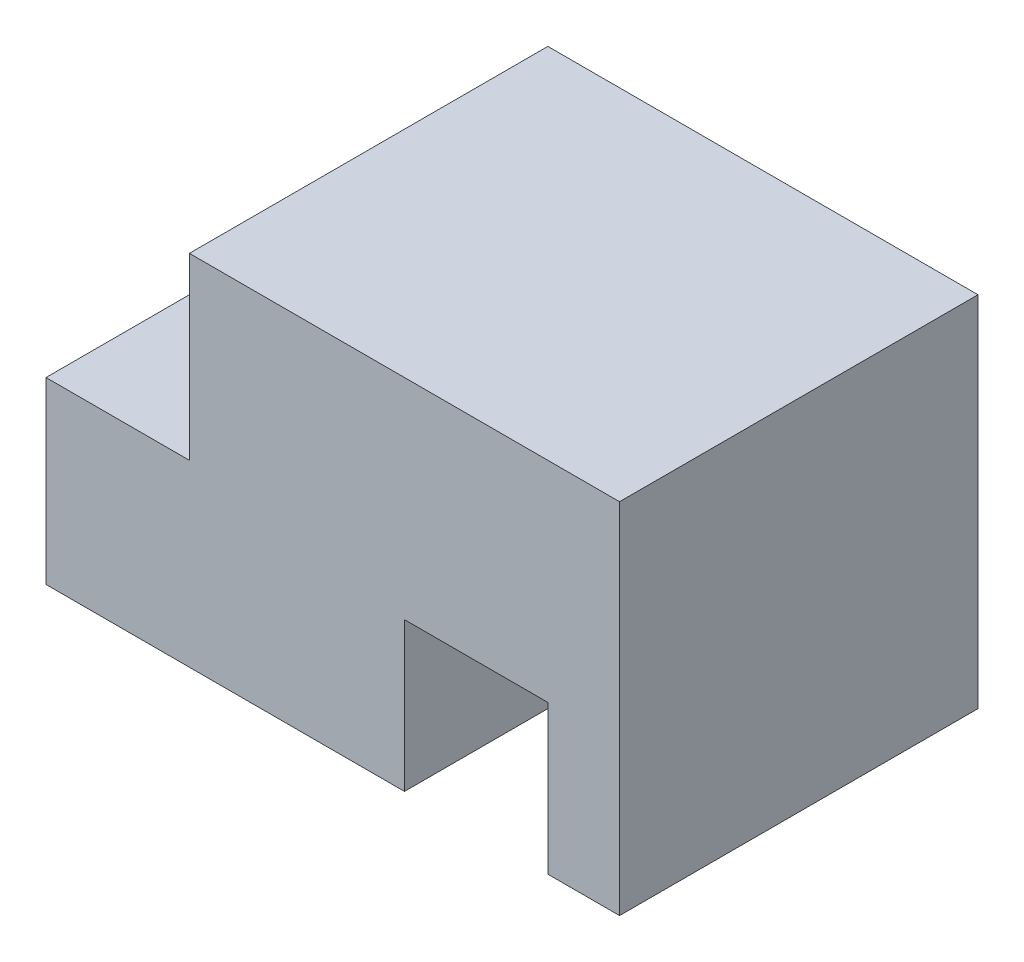
ISO-10303-21;
HEADER;
FILE_DESCRIPTION(('STEP AP214'),'2;1');
FILE_NAME('part.step','',(''),(''),'','','');
FILE_SCHEMA(('AUTOMOTIVE_DESIGN { 1 0 10303 214 1 1 1 1 }'));
ENDSEC;
DATA;
#1=APPLICATION_CONTEXT('core data for automotive mechanical design processes');
#2=APPLICATION_PROTOCOL_DEFINITION('international standard','automotive_design',2000,#1);
#3=PRODUCT_CONTEXT('',#1,'mechanical');
#4=PRODUCT('Part','Part','',(#3));
#5=PRODUCT_RELATED_PRODUCT_CATEGORY('part','',(#4));
#6=PRODUCT_DEFINITION_FORMATION('','',#4);
#7=PRODUCT_DEFINITION_CONTEXT('part definition',#1,'design');
#8=PRODUCT_DEFINITION('design','',#6,#7);
#9=PRODUCT_DEFINITION_SHAPE('','',#8);
#10=(LENGTH_UNIT() NAMED_UNIT(*) SI_UNIT(.MILLI.,.METRE.));
#11=(NAMED_UNIT(*) PLANE_ANGLE_UNIT() SI_UNIT($,.RADIAN.));
#12=(NAMED_UNIT(*) SI_UNIT($,.STERADIAN.) SOLID_ANGLE_UNIT());
#13=UNCERTAINTY_MEASURE_WITH_UNIT(LENGTH_MEASURE(1.E-05),#10,'distance_accuracy_value','');
#14=(GEOMETRIC_REPRESENTATION_CONTEXT(3) GLOBAL_UNCERTAINTY_ASSIGNED_CONTEXT((#13)) GLOBAL_UNIT_ASSIGNED_CONTEXT((#10,
#11,#12)) REPRESENTATION_CONTEXT('',''));
#15=CARTESIAN_POINT('',(0.,0.,0.));
#16=DIRECTION('',(0.,0.,1.));
#17=DIRECTION('',(1.,0.,0.));
#18=AXIS2_PLACEMENT_3D('',#15,#16,#17);
#19=CARTESIAN_POINT('',(-2511.75876010782,599.056603773585,1270.));
#20=DIRECTION('',(1.,0.,0.));
#21=DIRECTION('',(0.,0.,-1.));
#22=AXIS2_PLACEMENT_3D('',#19,#20,#21);
#23=PLANE('',#22);
#24=DIRECTION('',(0.,-1.,0.));
#25=VECTOR('',#24,1.);
#26=CARTESIAN_POINT('',(-2511.75876010782,599.056603773585,0.));
#27=LINE('',#26,#25);
#28=CARTESIAN_POINT('',(-2511.75876010782,599.056603773585,0.));
#29=VERTEX_POINT('',#28);
#30=CARTESIAN_POINT('',(-2511.75876010782,-35.9433962264152,0.));
#31=VERTEX_POINT('',#30);
#32=EDGE_CURVE('E160',#29,#31,#27,.T.);
#33=ORIENTED_EDGE('',*,*,#32,.T.);
#34=DIRECTION('',(0.,0.,-1.));
#35=VECTOR('',#34,1.);
#36=CARTESIAN_POINT('',(-2511.75876010782,-35.9433962264152,1270.));
#37=LINE('',#36,#35);
#38=CARTESIAN_POINT('',(-2511.75876010782,-35.9433962264152,1270.));
#39=VERTEX_POINT('',#38);
#40=EDGE_CURVE('E11',#39,#31,#37,.T.);
#41=ORIENTED_EDGE('',*,*,#40,.F.);
#42=DIRECTION('',(0.,-1.,0.));
#43=VECTOR('',#42,1.);
#44=CARTESIAN_POINT('',(-2511.75876010782,599.056603773585,1270.));
#45=LINE('',#44,#43);
#46=CARTESIAN_POINT('',(-2511.75876010782,599.056603773585,1270.));
#47=VERTEX_POINT('',#46);
#48=EDGE_CURVE('E188',#47,#39,#45,.T.);
#49=ORIENTED_EDGE('',*,*,#48,.F.);
#50=DIRECTION('',(0.,0.,-1.));
#51=VECTOR('',#50,1.);
#52=CARTESIAN_POINT('',(-2511.75876010782,599.056603773585,1270.));
#53=LINE('',#52,#51);
#54=EDGE_CURVE('E156',#47,#29,#53,.T.);
#55=ORIENTED_EDGE('',*,*,#54,.T.);
#56=EDGE_LOOP('',(#33,#41,#49,#55));
#57=FACE_BOUND('',#56,.T.);
#58=ADVANCED_FACE('F47',(#57),#23,.F.);
#59=CARTESIAN_POINT('',(-3019.75876010782,-35.9433962264152,1270.));
#60=DIRECTION('',(0.,-1.,0.));
#61=DIRECTION('',(1.,0.,0.));
#62=AXIS2_PLACEMENT_3D('',#59,#60,#61);
#63=PLANE('',#62);
#64=DIRECTION('',(-1.,0.,0.));
#65=VECTOR('',#64,1.);
#66=CARTESIAN_POINT('',(-3019.75876010782,-35.9433962264152,0.));
#67=LINE('',#66,#65);
#68=CARTESIAN_POINT('',(-3019.75876010782,-35.9433962264152,0.));
#69=VERTEX_POINT('',#68);
#70=EDGE_CURVE('E164',#31,#69,#67,.T.);
#71=ORIENTED_EDGE('',*,*,#70,.T.);
#72=DIRECTION('',(0.,0.,-1.));
#73=VECTOR('',#72,1.);
#74=CARTESIAN_POINT('',(-3019.75876010782,-35.9433962264152,1270.));
#75=LINE('',#74,#73);
#76=CARTESIAN_POINT('',(-3019.75876010782,-35.9433962264152,1270.));
#77=VERTEX_POINT('',#76);
#78=EDGE_CURVE('E56',#77,#69,#75,.T.);
#79=ORIENTED_EDGE('',*,*,#78,.F.);
#80=DIRECTION('',(-1.,0.,0.));
#81=VECTOR('',#80,1.);
#82=CARTESIAN_POINT('',(-3019.75876010782,-35.9433962264152,1270.));
#83=LINE('',#82,#81);
#84=EDGE_CURVE('E112',#39,#77,#83,.T.);
#85=ORIENTED_EDGE('',*,*,#84,.F.);
#86=ORIENTED_EDGE('',*,*,#40,.T.);
#87=EDGE_LOOP('',(#71,#79,#85,#86));
#88=FACE_BOUND('',#87,.T.);
#89=ADVANCED_FACE('F252',(#88),#63,.F.);
#90=CARTESIAN_POINT('',(-3019.75876010782,-35.9433962264152,1270.));
#91=DIRECTION('',(1.,0.,0.));
#92=DIRECTION('',(0.,0.,-1.));
#93=AXIS2_PLACEMENT_3D('',#90,#91,#92);
#94=PLANE('',#93);
#95=DIRECTION('',(0.,-1.,0.));
#96=VECTOR('',#95,1.);
#97=CARTESIAN_POINT('',(-3019.75876010782,-35.9433962264152,0.));
#98=LINE('',#97,#96);
#99=CARTESIAN_POINT('',(-3019.75876010782,-670.943396226415,0.));
#100=VERTEX_POINT('',#99);
#101=EDGE_CURVE('E167',#69,#100,#98,.T.);
#102=ORIENTED_EDGE('',*,*,#101,.T.);
#103=DIRECTION('',(0.,0.,-1.));
#104=VECTOR('',#103,1.);
#105=CARTESIAN_POINT('',(-3019.75876010782,-670.943396226415,1270.));
#106=LINE('',#105,#104);
#107=CARTESIAN_POINT('',(-3019.75876010782,-670.943396226415,1270.));
#108=VERTEX_POINT('',#107);
#109=EDGE_CURVE('E207',#108,#100,#106,.T.);
#110=ORIENTED_EDGE('',*,*,#109,.F.);
#111=DIRECTION('',(0.,-1.,0.));
#112=VECTOR('',#111,1.);
#113=CARTESIAN_POINT('',(-3019.75876010782,-35.9433962264152,1270.));
#114=LINE('',#113,#112);
#115=EDGE_CURVE('E217',#77,#108,#114,.T.);
#116=ORIENTED_EDGE('',*,*,#115,.F.);
#117=ORIENTED_EDGE('',*,*,#78,.T.);
#118=EDGE_LOOP('',(#102,#110,#116,#117));
#119=FACE_BOUND('',#118,.T.);
#120=ADVANCED_FACE('F215',(#119),#94,.F.);
#121=CARTESIAN_POINT('',(-3019.75876010782,-670.943396226415,1270.));
#122=DIRECTION('',(0.,1.,0.));
#123=DIRECTION('',(0.,0.,1.));
#124=AXIS2_PLACEMENT_3D('',#121,#122,#123);
#125=PLANE('',#124);
#126=DIRECTION('',(1.,0.,0.));
#127=VECTOR('',#126,1.);
#128=CARTESIAN_POINT('',(-3019.75876010782,-670.943396226415,0.));
#129=LINE('',#128,#127);
#130=CARTESIAN_POINT('',(-1749.75876010782,-670.943396226415,0.));
#131=VERTEX_POINT('',#130);
#132=EDGE_CURVE('E170',#100,#131,#129,.T.);
#133=ORIENTED_EDGE('',*,*,#132,.T.);
#134=DIRECTION('',(0.,0.,-1.));
#135=VECTOR('',#134,1.);
#136=CARTESIAN_POINT('',(-1749.75876010782,-670.943396226415,1270.));
#137=LINE('',#136,#135);
#138=CARTESIAN_POINT('',(-1749.75876010782,-670.943396226415,1270.));
#139=VERTEX_POINT('',#138);
#140=EDGE_CURVE('E203',#139,#131,#137,.T.);
#141=ORIENTED_EDGE('',*,*,#140,.F.);
#142=DIRECTION('',(1.,0.,0.));
#143=VECTOR('',#142,1.);
#144=CARTESIAN_POINT('',(-3019.75876010782,-670.943396226415,1270.));
#145=LINE('',#144,#143);
#146=EDGE_CURVE('E236',#108,#139,#145,.T.);
#147=ORIENTED_EDGE('',*,*,#146,.F.);
#148=ORIENTED_EDGE('',*,*,#109,.T.);
#149=EDGE_LOOP('',(#133,#141,#147,#148));
#150=FACE_BOUND('',#149,.T.);
#151=ADVANCED_FACE('F226',(#150),#125,.F.);
#152=CARTESIAN_POINT('',(-1749.75876010782,-143.77358490566,1270.));
#153=DIRECTION('',(-1.,0.,0.));
#154=DIRECTION('',(0.,-1.,0.));
#155=AXIS2_PLACEMENT_3D('',#152,#153,#154);
#156=PLANE('',#155);
#157=DIRECTION('',(0.,1.,0.));
#158=VECTOR('',#157,1.);
#159=CARTESIAN_POINT('',(-1749.75876010782,-143.77358490566,0.));
#160=LINE('',#159,#158);
#161=CARTESIAN_POINT('',(-1749.75876010782,-143.77358490566,0.));
#162=VERTEX_POINT('',#161);
#163=EDGE_CURVE('E173',#131,#162,#160,.T.);
#164=ORIENTED_EDGE('',*,*,#163,.T.);
#165=DIRECTION('',(0.,0.,-1.));
#166=VECTOR('',#165,1.);
#167=CARTESIAN_POINT('',(-1749.75876010782,-143.77358490566,1270.));
#168=LINE('',#167,#166);
#169=CARTESIAN_POINT('',(-1749.75876010782,-143.77358490566,1270.));
#170=VERTEX_POINT('',#169);
#171=EDGE_CURVE('E199',#170,#162,#168,.T.);
#172=ORIENTED_EDGE('',*,*,#171,.F.);
#173=DIRECTION('',(0.,1.,0.));
#174=VECTOR('',#173,1.);
#175=CARTESIAN_POINT('',(-1749.75876010782,-143.77358490566,1270.));
#176=LINE('',#175,#174);
#177=EDGE_CURVE('E232',#139,#170,#176,.T.);
#178=ORIENTED_EDGE('',*,*,#177,.F.);
#179=ORIENTED_EDGE('',*,*,#140,.T.);
#180=EDGE_LOOP('',(#164,#172,#178,#179));
#181=FACE_BOUND('',#180,.T.);
#182=ADVANCED_FACE('F230',(#181),#156,.F.);
#183=CARTESIAN_POINT('',(-1749.75876010782,-143.77358490566,1270.));
#184=DIRECTION('',(0.,1.,0.));
#185=DIRECTION('',(0.,0.,1.));
#186=AXIS2_PLACEMENT_3D('',#183,#184,#185);
#187=PLANE('',#186);
#188=DIRECTION('',(1.,0.,0.));
#189=VECTOR('',#188,1.);
#190=CARTESIAN_POINT('',(-1749.75876010782,-143.77358490566,0.));
#191=LINE('',#190,#189);
#192=CARTESIAN_POINT('',(-1241.75876010782,-143.77358490566,0.));
#193=VERTEX_POINT('',#192);
#194=EDGE_CURVE('E176',#162,#193,#191,.T.);
#195=ORIENTED_EDGE('',*,*,#194,.T.);
#196=DIRECTION('',(0.,0.,-1.));
#197=VECTOR('',#196,1.);
#198=CARTESIAN_POINT('',(-1241.75876010782,-143.77358490566,1270.));
#199=LINE('',#198,#197);
#200=CARTESIAN_POINT('',(-1241.75876010782,-143.77358490566,1270.));
#201=VERTEX_POINT('',#200);
#202=EDGE_CURVE('E195',#201,#193,#199,.T.);
#203=ORIENTED_EDGE('',*,*,#202,.F.);
#204=DIRECTION('',(1.,0.,0.));
#205=VECTOR('',#204,1.);
#206=CARTESIAN_POINT('',(-1749.75876010782,-143.77358490566,1270.));
#207=LINE('',#206,#205);
#208=EDGE_CURVE('E235',#170,#201,#207,.T.);
#209=ORIENTED_EDGE('',*,*,#208,.F.);
#210=ORIENTED_EDGE('',*,*,#171,.T.);
#211=EDGE_LOOP('',(#195,#203,#209,#210));
#212=FACE_BOUND('',#211,.T.);
#213=ADVANCED_FACE('F263',(#212),#187,.F.);
#214=CARTESIAN_POINT('',(-1241.75876010782,-143.77358490566,1270.));
#215=DIRECTION('',(1.,0.,0.));
#216=DIRECTION('',(0.,0.,-1.));
#217=AXIS2_PLACEMENT_3D('',#214,#215,#216);
#218=PLANE('',#217);
#219=DIRECTION('',(0.,-1.,0.));
#220=VECTOR('',#219,1.);
#221=CARTESIAN_POINT('',(-1241.75876010782,-143.77358490566,0.));
#222=LINE('',#221,#220);
#223=CARTESIAN_POINT('',(-1241.75876010782,-670.943396226415,0.));
#224=VERTEX_POINT('',#223);
#225=EDGE_CURVE('E179',#193,#224,#222,.T.);
#226=ORIENTED_EDGE('',*,*,#225,.T.);
#227=DIRECTION('',(0.,0.,-1.));
#228=VECTOR('',#227,1.);
#229=CARTESIAN_POINT('',(-1241.75876010782,-670.943396226415,1270.));
#230=LINE('',#229,#228);
#231=CARTESIAN_POINT('',(-1241.75876010782,-670.943396226415,1270.));
#232=VERTEX_POINT('',#231);
#233=EDGE_CURVE('E149',#232,#224,#230,.T.);
#234=ORIENTED_EDGE('',*,*,#233,.F.);
#235=DIRECTION('',(0.,-1.,0.));
#236=VECTOR('',#235,1.);
#237=CARTESIAN_POINT('',(-1241.75876010782,-143.77358490566,1270.));
#238=LINE('',#237,#236);
#239=EDGE_CURVE('E137',#201,#232,#238,.T.);
#240=ORIENTED_EDGE('',*,*,#239,.F.);
#241=ORIENTED_EDGE('',*,*,#202,.T.);
#242=EDGE_LOOP('',(#226,#234,#240,#241));
#243=FACE_BOUND('',#242,.T.);
#244=ADVANCED_FACE('F266',(#243),#218,.F.);
#245=CARTESIAN_POINT('',(-1241.75876010782,-670.943396226415,1270.));
#246=DIRECTION('',(0.,1.,0.));
#247=DIRECTION('',(0.,0.,1.));
#248=AXIS2_PLACEMENT_3D('',#245,#246,#247);
#249=PLANE('',#248);
#250=DIRECTION('',(1.,0.,0.));
#251=VECTOR('',#250,1.);
#252=CARTESIAN_POINT('',(-1241.75876010782,-670.943396226415,0.));
#253=LINE('',#252,#251);
#254=CARTESIAN_POINT('',(-987.758760107817,-670.943396226415,0.));
#255=VERTEX_POINT('',#254);
#256=EDGE_CURVE('E147',#224,#255,#253,.T.);
#257=ORIENTED_EDGE('',*,*,#256,.T.);
#258=DIRECTION('',(0.,0.,-1.));
#259=VECTOR('',#258,1.);
#260=CARTESIAN_POINT('',(-987.758760107817,-670.943396226415,1270.));
#261=LINE('',#260,#259);
#262=CARTESIAN_POINT('',(-987.758760107817,-670.943396226415,1270.));
#263=VERTEX_POINT('',#262);
#264=EDGE_CURVE('E144',#263,#255,#261,.T.);
#265=ORIENTED_EDGE('',*,*,#264,.F.);
#266=DIRECTION('',(1.,0.,0.));
#267=VECTOR('',#266,1.);
#268=CARTESIAN_POINT('',(-1241.75876010782,-670.943396226415,1270.));
#269=LINE('',#268,#267);
#270=EDGE_CURVE('E131',#232,#263,#269,.T.);
#271=ORIENTED_EDGE('',*,*,#270,.F.);
#272=ORIENTED_EDGE('',*,*,#233,.T.);
#273=EDGE_LOOP('',(#257,#265,#271,#272));
#274=FACE_BOUND('',#273,.T.);
#275=ADVANCED_FACE('F145',(#274),#249,.F.);
#276=CARTESIAN_POINT('',(-987.758760107817,599.056603773585,1270.));
#277=DIRECTION('',(-1.,0.,0.));
#278=DIRECTION('',(0.,-1.,0.));
#279=AXIS2_PLACEMENT_3D('',#276,#277,#278);
#280=PLANE('',#279);
#281=DIRECTION('',(0.,1.,0.));
#282=VECTOR('',#281,1.);
#283=CARTESIAN_POINT('',(-987.758760107817,599.056603773585,0.));
#284=LINE('',#283,#282);
#285=CARTESIAN_POINT('',(-987.758760107817,599.056603773585,0.));
#286=VERTEX_POINT('',#285);
#287=EDGE_CURVE('E98',#255,#286,#284,.T.);
#288=ORIENTED_EDGE('',*,*,#287,.T.);
#289=DIRECTION('',(0.,0.,-1.));
#290=VECTOR('',#289,1.);
#291=CARTESIAN_POINT('',(-987.758760107817,599.056603773585,1270.));
#292=LINE('',#291,#290);
#293=CARTESIAN_POINT('',(-987.758760107817,599.056603773585,1270.));
#294=VERTEX_POINT('',#293);
#295=EDGE_CURVE('E150',#294,#286,#292,.T.);
#296=ORIENTED_EDGE('',*,*,#295,.F.);
#297=DIRECTION('',(0.,1.,0.));
#298=VECTOR('',#297,1.);
#299=CARTESIAN_POINT('',(-987.758760107817,-570.301886792453,1270.));
#300=LINE('',#299,#298);
#301=EDGE_CURVE('E135',#263,#294,#300,.T.);
#302=ORIENTED_EDGE('',*,*,#301,.F.);
#303=ORIENTED_EDGE('',*,*,#264,.T.);
#304=EDGE_LOOP('',(#288,#296,#302,#303));
#305=FACE_BOUND('',#304,.T.);
#306=ADVANCED_FACE('F152',(#305),#280,.F.);
#307=CARTESIAN_POINT('',(-2511.75876010782,599.056603773585,1270.));
#308=DIRECTION('',(0.,-1.,0.));
#309=DIRECTION('',(0.,0.,-1.));
#310=AXIS2_PLACEMENT_3D('',#307,#308,#309);
#311=PLANE('',#310);
#312=DIRECTION('',(-1.,0.,0.));
#313=VECTOR('',#312,1.);
#314=CARTESIAN_POINT('',(-2511.75876010782,599.056603773585,0.));
#315=LINE('',#314,#313);
#316=EDGE_CURVE('E104',#286,#29,#315,.T.);
#317=ORIENTED_EDGE('',*,*,#316,.T.);
#318=ORIENTED_EDGE('',*,*,#54,.F.);
#319=DIRECTION('',(-1.,0.,0.));
#320=VECTOR('',#319,1.);
#321=CARTESIAN_POINT('',(-2511.75876010782,599.056603773585,1270.));
#322=LINE('',#321,#320);
#323=EDGE_CURVE('E64',#294,#47,#322,.T.);
#324=ORIENTED_EDGE('',*,*,#323,.F.);
#325=ORIENTED_EDGE('',*,*,#295,.T.);
#326=EDGE_LOOP('',(#317,#318,#324,#325));
#327=FACE_BOUND('',#326,.T.);
#328=ADVANCED_FACE('F275',(#327),#311,.F.);
#329=CARTESIAN_POINT('',(0.,0.,1270.));
#330=DIRECTION('',(0.,0.,1.));
#331=DIRECTION('',(1.,0.,0.));
#332=AXIS2_PLACEMENT_3D('',#329,#330,#331);
#333=PLANE('',#332);
#334=ORIENTED_EDGE('',*,*,#48,.T.);
#335=ORIENTED_EDGE('',*,*,#84,.T.);
#336=ORIENTED_EDGE('',*,*,#115,.T.);
#337=ORIENTED_EDGE('',*,*,#146,.T.);
#338=ORIENTED_EDGE('',*,*,#177,.T.);
#339=ORIENTED_EDGE('',*,*,#208,.T.);
#340=ORIENTED_EDGE('',*,*,#239,.T.);
#341=ORIENTED_EDGE('',*,*,#270,.T.);
#342=ORIENTED_EDGE('',*,*,#301,.T.);
#343=ORIENTED_EDGE('',*,*,#323,.T.);
#344=EDGE_LOOP('',(#334,#335,#336,#337,#338,#339,#340,#341,#342,#343));
#345=FACE_BOUND('',#344,.T.);
#346=ADVANCED_FACE('F133',(#345),#333,.T.);
#347=CARTESIAN_POINT('',(0.,0.,0.));
#348=DIRECTION('',(0.,0.,1.));
#349=DIRECTION('',(1.,0.,0.));
#350=AXIS2_PLACEMENT_3D('',#347,#348,#349);
#351=PLANE('',#350);
#352=ORIENTED_EDGE('',*,*,#32,.F.);
#353=ORIENTED_EDGE('',*,*,#316,.F.);
#354=ORIENTED_EDGE('',*,*,#287,.F.);
#355=ORIENTED_EDGE('',*,*,#256,.F.);
#356=ORIENTED_EDGE('',*,*,#225,.F.);
#357=ORIENTED_EDGE('',*,*,#194,.F.);
#358=ORIENTED_EDGE('',*,*,#163,.F.);
#359=ORIENTED_EDGE('',*,*,#132,.F.);
#360=ORIENTED_EDGE('',*,*,#101,.F.);
#361=ORIENTED_EDGE('',*,*,#70,.F.);
#362=EDGE_LOOP('',(#352,#353,#354,#355,#356,#357,#358,#359,#360,#361));
#363=FACE_BOUND('',#362,.T.);
#364=ADVANCED_FACE('F221',(#363),#351,.F.);
#365=CLOSED_SHELL('',(#58,#89,#120,#151,#182,#213,#244,#275,#306,#328,#346,#364));
#366=MANIFOLD_SOLID_BREP('B2',#365);
#367=ADVANCED_BREP_SHAPE_REPRESENTATION('',(#18,#366),#14);
#368=SHAPE_DEFINITION_REPRESENTATION(#9,#367);
ENDSEC;
END-ISO-10303-21;
